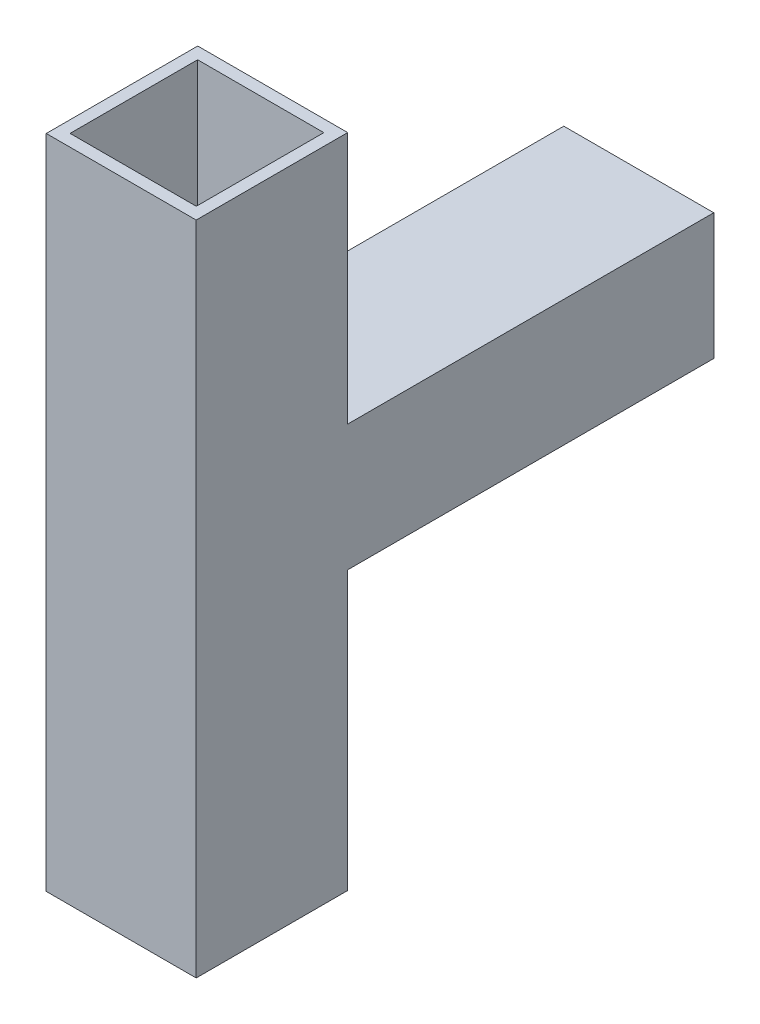
ISO-10303-21;
HEADER;
FILE_DESCRIPTION(('STEP AP214'),'2;1');
FILE_NAME('part.step','',(''),(''),'','','');
FILE_SCHEMA(('AUTOMOTIVE_DESIGN { 1 0 10303 214 1 1 1 1 }'));
ENDSEC;
DATA;
#1=APPLICATION_CONTEXT('core data for automotive mechanical design processes');
#2=APPLICATION_PROTOCOL_DEFINITION('international standard','automotive_design',2000,#1);
#3=PRODUCT_CONTEXT('',#1,'mechanical');
#4=PRODUCT('Part','Part','',(#3));
#5=PRODUCT_RELATED_PRODUCT_CATEGORY('part','',(#4));
#6=PRODUCT_DEFINITION_FORMATION('','',#4);
#7=PRODUCT_DEFINITION_CONTEXT('part definition',#1,'design');
#8=PRODUCT_DEFINITION('design','',#6,#7);
#9=PRODUCT_DEFINITION_SHAPE('','',#8);
#10=(LENGTH_UNIT() NAMED_UNIT(*) SI_UNIT(.MILLI.,.METRE.));
#11=(NAMED_UNIT(*) PLANE_ANGLE_UNIT() SI_UNIT($,.RADIAN.));
#12=(NAMED_UNIT(*) SI_UNIT($,.STERADIAN.) SOLID_ANGLE_UNIT());
#13=UNCERTAINTY_MEASURE_WITH_UNIT(LENGTH_MEASURE(1.E-05),#10,'distance_accuracy_value','');
#14=(GEOMETRIC_REPRESENTATION_CONTEXT(3) GLOBAL_UNCERTAINTY_ASSIGNED_CONTEXT((#13)) GLOBAL_UNIT_ASSIGNED_CONTEXT((#10,
#11,#12)) REPRESENTATION_CONTEXT('',''));
#15=CARTESIAN_POINT('',(0.,0.,0.));
#16=DIRECTION('',(0.,0.,1.));
#17=DIRECTION('',(1.,0.,0.));
#18=AXIS2_PLACEMENT_3D('',#15,#16,#17);
#19=CARTESIAN_POINT('',(-2.96937918952685,26.,-3.));
#20=DIRECTION('',(0.,0.,1.));
#21=DIRECTION('',(1.,0.,0.));
#22=AXIS2_PLACEMENT_3D('',#19,#20,#21);
#23=PLANE('',#22);
#24=DIRECTION('',(1.,0.,0.));
#25=VECTOR('',#24,1.);
#26=CARTESIAN_POINT('',(2.96937918952685,16.,-3.));
#27=LINE('',#26,#25);
#28=CARTESIAN_POINT('',(-2.96937918952685,16.,-3.));
#29=VERTEX_POINT('',#28);
#30=CARTESIAN_POINT('',(2.96937918952685,16.,-3.));
#31=VERTEX_POINT('',#30);
#32=EDGE_CURVE('E203',#29,#31,#27,.T.);
#33=ORIENTED_EDGE('',*,*,#32,.F.);
#34=DIRECTION('',(0.,-1.,0.));
#35=VECTOR('',#34,1.);
#36=CARTESIAN_POINT('',(-2.96937918952685,26.,-3.));
#37=LINE('',#36,#35);
#38=CARTESIAN_POINT('',(-2.96937918952685,26.,-3.));
#39=VERTEX_POINT('',#38);
#40=EDGE_CURVE('E312',#39,#29,#37,.T.);
#41=ORIENTED_EDGE('',*,*,#40,.F.);
#42=DIRECTION('',(-1.,0.,0.));
#43=VECTOR('',#42,1.);
#44=CARTESIAN_POINT('',(-2.96937918952685,26.,-3.));
#45=LINE('',#44,#43);
#46=CARTESIAN_POINT('',(2.96937918952685,26.,-3.));
#47=VERTEX_POINT('',#46);
#48=EDGE_CURVE('E282',#47,#39,#45,.T.);
#49=ORIENTED_EDGE('',*,*,#48,.F.);
#50=DIRECTION('',(0.,-1.,0.));
#51=VECTOR('',#50,1.);
#52=CARTESIAN_POINT('',(2.96937918952685,26.,-3.));
#53=LINE('',#52,#51);
#54=EDGE_CURVE('E11',#47,#31,#53,.T.);
#55=ORIENTED_EDGE('',*,*,#54,.T.);
#56=EDGE_LOOP('',(#33,#41,#49,#55));
#57=FACE_BOUND('',#56,.T.);
#58=ADVANCED_FACE('F38',(#57),#23,.F.);
#59=DIRECTION('',(-1.,0.,0.));
#60=VECTOR('',#59,1.);
#61=CARTESIAN_POINT('',(2.96937918952685,11.,-3.));
#62=LINE('',#61,#60);
#63=CARTESIAN_POINT('',(2.96937918952685,11.,-3.));
#64=VERTEX_POINT('',#63);
#65=CARTESIAN_POINT('',(-2.96937918952685,11.,-3.));
#66=VERTEX_POINT('',#65);
#67=EDGE_CURVE('E197',#64,#66,#62,.T.);
#68=ORIENTED_EDGE('',*,*,#67,.F.);
#69=CARTESIAN_POINT('',(2.96937918952685,0.,-3.));
#70=VERTEX_POINT('',#69);
#71=EDGE_CURVE('E47',#64,#70,#53,.T.);
#72=ORIENTED_EDGE('',*,*,#71,.T.);
#73=DIRECTION('',(-1.,0.,0.));
#74=VECTOR('',#73,1.);
#75=CARTESIAN_POINT('',(-2.96937918952685,0.,-3.));
#76=LINE('',#75,#74);
#77=CARTESIAN_POINT('',(-2.96937918952685,0.,-3.));
#78=VERTEX_POINT('',#77);
#79=EDGE_CURVE('E296',#70,#78,#76,.T.);
#80=ORIENTED_EDGE('',*,*,#79,.T.);
#81=EDGE_CURVE('E311',#66,#78,#37,.T.);
#82=ORIENTED_EDGE('',*,*,#81,.F.);
#83=EDGE_LOOP('',(#68,#72,#80,#82));
#84=FACE_BOUND('',#83,.T.);
#85=ADVANCED_FACE('F328',(#84),#23,.F.);
#86=CARTESIAN_POINT('',(0.,26.,0.));
#87=DIRECTION('',(0.,-1.,0.));
#88=DIRECTION('',(0.,0.,-1.));
#89=AXIS2_PLACEMENT_3D('',#86,#87,#88);
#90=PLANE('',#89);
#91=DIRECTION('',(0.,0.,-1.));
#92=VECTOR('',#91,1.);
#93=CARTESIAN_POINT('',(2.96937918952685,26.,3.));
#94=LINE('',#93,#92);
#95=CARTESIAN_POINT('',(2.96937918952685,26.,3.));
#96=VERTEX_POINT('',#95);
#97=EDGE_CURVE('E278',#96,#47,#94,.T.);
#98=ORIENTED_EDGE('',*,*,#97,.T.);
#99=ORIENTED_EDGE('',*,*,#48,.T.);
#100=DIRECTION('',(0.,0.,1.));
#101=VECTOR('',#100,1.);
#102=CARTESIAN_POINT('',(-2.96937918952685,26.,3.));
#103=LINE('',#102,#101);
#104=CARTESIAN_POINT('',(-2.96937918952685,26.,3.));
#105=VERTEX_POINT('',#104);
#106=EDGE_CURVE('E286',#39,#105,#103,.T.);
#107=ORIENTED_EDGE('',*,*,#106,.T.);
#108=DIRECTION('',(1.,0.,0.));
#109=VECTOR('',#108,1.);
#110=CARTESIAN_POINT('',(-2.96937918952685,26.,3.));
#111=LINE('',#110,#109);
#112=EDGE_CURVE('E289',#105,#96,#111,.T.);
#113=ORIENTED_EDGE('',*,*,#112,.T.);
#114=EDGE_LOOP('',(#98,#99,#107,#113));
#115=FACE_BOUND('',#114,.T.);
#116=DIRECTION('',(0.,0.,-1.));
#117=VECTOR('',#116,1.);
#118=CARTESIAN_POINT('',(2.5,26.,2.5257804818101));
#119=LINE('',#118,#117);
#120=CARTESIAN_POINT('',(2.5,26.,2.5257804818101));
#121=VERTEX_POINT('',#120);
#122=CARTESIAN_POINT('',(2.5,26.,-2.5257804818101));
#123=VERTEX_POINT('',#122);
#124=EDGE_CURVE('E235',#121,#123,#119,.T.);
#125=ORIENTED_EDGE('',*,*,#124,.F.);
#126=DIRECTION('',(1.,0.,0.));
#127=VECTOR('',#126,1.);
#128=CARTESIAN_POINT('',(-2.5,26.,2.5257804818101));
#129=LINE('',#128,#127);
#130=CARTESIAN_POINT('',(-2.5,26.,2.5257804818101));
#131=VERTEX_POINT('',#130);
#132=EDGE_CURVE('E246',#131,#121,#129,.T.);
#133=ORIENTED_EDGE('',*,*,#132,.F.);
#134=DIRECTION('',(0.,0.,1.));
#135=VECTOR('',#134,1.);
#136=CARTESIAN_POINT('',(-2.5,26.,2.5257804818101));
#137=LINE('',#136,#135);
#138=CARTESIAN_POINT('',(-2.5,26.,-2.5257804818101));
#139=VERTEX_POINT('',#138);
#140=EDGE_CURVE('E242',#139,#131,#137,.T.);
#141=ORIENTED_EDGE('',*,*,#140,.F.);
#142=DIRECTION('',(-1.,0.,0.));
#143=VECTOR('',#142,1.);
#144=CARTESIAN_POINT('',(-2.5,26.,-2.5257804818101));
#145=LINE('',#144,#143);
#146=EDGE_CURVE('E238',#123,#139,#145,.T.);
#147=ORIENTED_EDGE('',*,*,#146,.F.);
#148=EDGE_LOOP('',(#125,#133,#141,#147));
#149=FACE_BOUND('',#148,.T.);
#150=ADVANCED_FACE('F343',(#115,#149),#90,.F.);
#151=CARTESIAN_POINT('',(0.,0.,0.));
#152=DIRECTION('',(0.,-1.,0.));
#153=DIRECTION('',(0.,0.,-1.));
#154=AXIS2_PLACEMENT_3D('',#151,#152,#153);
#155=PLANE('',#154);
#156=DIRECTION('',(0.,0.,-1.));
#157=VECTOR('',#156,1.);
#158=CARTESIAN_POINT('',(2.96937918952685,0.,3.));
#159=LINE('',#158,#157);
#160=CARTESIAN_POINT('',(2.96937918952685,0.,3.));
#161=VERTEX_POINT('',#160);
#162=EDGE_CURVE('E277',#161,#70,#159,.T.);
#163=ORIENTED_EDGE('',*,*,#162,.F.);
#164=DIRECTION('',(1.,0.,0.));
#165=VECTOR('',#164,1.);
#166=CARTESIAN_POINT('',(-2.96937918952685,0.,3.));
#167=LINE('',#166,#165);
#168=CARTESIAN_POINT('',(-2.96937918952685,0.,3.));
#169=VERTEX_POINT('',#168);
#170=EDGE_CURVE('E283',#169,#161,#167,.T.);
#171=ORIENTED_EDGE('',*,*,#170,.F.);
#172=DIRECTION('',(0.,0.,1.));
#173=VECTOR('',#172,1.);
#174=CARTESIAN_POINT('',(-2.96937918952685,0.,3.));
#175=LINE('',#174,#173);
#176=EDGE_CURVE('E300',#78,#169,#175,.T.);
#177=ORIENTED_EDGE('',*,*,#176,.F.);
#178=ORIENTED_EDGE('',*,*,#79,.F.);
#179=EDGE_LOOP('',(#163,#171,#177,#178));
#180=FACE_BOUND('',#179,.T.);
#181=DIRECTION('',(1.,0.,0.));
#182=VECTOR('',#181,1.);
#183=CARTESIAN_POINT('',(-2.5,0.,2.5257804818101));
#184=LINE('',#183,#182);
#185=CARTESIAN_POINT('',(-2.5,0.,2.5257804818101));
#186=VERTEX_POINT('',#185);
#187=CARTESIAN_POINT('',(2.5,0.,2.5257804818101));
#188=VERTEX_POINT('',#187);
#189=EDGE_CURVE('E239',#186,#188,#184,.T.);
#190=ORIENTED_EDGE('',*,*,#189,.T.);
#191=DIRECTION('',(0.,0.,-1.));
#192=VECTOR('',#191,1.);
#193=CARTESIAN_POINT('',(2.5,0.,2.5257804818101));
#194=LINE('',#193,#192);
#195=CARTESIAN_POINT('',(2.5,0.,-2.5257804818101));
#196=VERTEX_POINT('',#195);
#197=EDGE_CURVE('E234',#188,#196,#194,.T.);
#198=ORIENTED_EDGE('',*,*,#197,.T.);
#199=DIRECTION('',(-1.,0.,0.));
#200=VECTOR('',#199,1.);
#201=CARTESIAN_POINT('',(-2.5,0.,-2.5257804818101));
#202=LINE('',#201,#200);
#203=CARTESIAN_POINT('',(-2.5,0.,-2.5257804818101));
#204=VERTEX_POINT('',#203);
#205=EDGE_CURVE('E253',#196,#204,#202,.T.);
#206=ORIENTED_EDGE('',*,*,#205,.T.);
#207=DIRECTION('',(0.,0.,1.));
#208=VECTOR('',#207,1.);
#209=CARTESIAN_POINT('',(-2.5,0.,2.5257804818101));
#210=LINE('',#209,#208);
#211=EDGE_CURVE('E257',#204,#186,#210,.T.);
#212=ORIENTED_EDGE('',*,*,#211,.T.);
#213=EDGE_LOOP('',(#190,#198,#206,#212));
#214=FACE_BOUND('',#213,.T.);
#215=ADVANCED_FACE('F333',(#180,#214),#155,.T.);
#216=CARTESIAN_POINT('',(2.96937918952685,26.,3.));
#217=DIRECTION('',(-1.,0.,0.));
#218=DIRECTION('',(0.,0.,1.));
#219=AXIS2_PLACEMENT_3D('',#216,#217,#218);
#220=PLANE('',#219);
#221=ORIENTED_EDGE('',*,*,#162,.T.);
#222=ORIENTED_EDGE('',*,*,#71,.F.);
#223=DIRECTION('',(0.,0.,1.));
#224=VECTOR('',#223,1.);
#225=CARTESIAN_POINT('',(2.96937918952685,11.,-17.5));
#226=LINE('',#225,#224);
#227=CARTESIAN_POINT('',(2.96937918952685,11.,-17.5));
#228=VERTEX_POINT('',#227);
#229=EDGE_CURVE('E230',#228,#64,#226,.T.);
#230=ORIENTED_EDGE('',*,*,#229,.F.);
#231=DIRECTION('',(0.,-1.,0.));
#232=VECTOR('',#231,1.);
#233=CARTESIAN_POINT('',(2.96937918952685,11.,-17.5));
#234=LINE('',#233,#232);
#235=CARTESIAN_POINT('',(2.96937918952685,16.,-17.5));
#236=VERTEX_POINT('',#235);
#237=EDGE_CURVE('E198',#236,#228,#234,.T.);
#238=ORIENTED_EDGE('',*,*,#237,.F.);
#239=DIRECTION('',(0.,0.,1.));
#240=VECTOR('',#239,1.);
#241=CARTESIAN_POINT('',(2.96937918952685,16.,-17.5));
#242=LINE('',#241,#240);
#243=EDGE_CURVE('E212',#236,#31,#242,.T.);
#244=ORIENTED_EDGE('',*,*,#243,.T.);
#245=ORIENTED_EDGE('',*,*,#54,.F.);
#246=ORIENTED_EDGE('',*,*,#97,.F.);
#247=DIRECTION('',(0.,-1.,0.));
#248=VECTOR('',#247,1.);
#249=CARTESIAN_POINT('',(2.96937918952685,26.,3.));
#250=LINE('',#249,#248);
#251=EDGE_CURVE('E292',#96,#161,#250,.T.);
#252=ORIENTED_EDGE('',*,*,#251,.T.);
#253=EDGE_LOOP('',(#221,#222,#230,#238,#244,#245,#246,#252));
#254=FACE_BOUND('',#253,.T.);
#255=ADVANCED_FACE('F40',(#254),#220,.F.);
#256=CARTESIAN_POINT('',(-2.96937918952685,26.,3.));
#257=DIRECTION('',(1.,0.,0.));
#258=DIRECTION('',(0.,0.,-1.));
#259=AXIS2_PLACEMENT_3D('',#256,#257,#258);
#260=PLANE('',#259);
#261=ORIENTED_EDGE('',*,*,#176,.T.);
#262=DIRECTION('',(0.,-1.,0.));
#263=VECTOR('',#262,1.);
#264=CARTESIAN_POINT('',(-2.96937918952685,26.,3.));
#265=LINE('',#264,#263);
#266=EDGE_CURVE('E308',#105,#169,#265,.T.);
#267=ORIENTED_EDGE('',*,*,#266,.F.);
#268=ORIENTED_EDGE('',*,*,#106,.F.);
#269=ORIENTED_EDGE('',*,*,#40,.T.);
#270=DIRECTION('',(0.,0.,1.));
#271=VECTOR('',#270,1.);
#272=CARTESIAN_POINT('',(-2.96937918952685,16.,-17.5));
#273=LINE('',#272,#271);
#274=CARTESIAN_POINT('',(-2.96937918952685,16.,-17.5));
#275=VERTEX_POINT('',#274);
#276=EDGE_CURVE('E222',#275,#29,#273,.T.);
#277=ORIENTED_EDGE('',*,*,#276,.F.);
#278=DIRECTION('',(0.,1.,0.));
#279=VECTOR('',#278,1.);
#280=CARTESIAN_POINT('',(-2.96937918952685,11.,-17.5));
#281=LINE('',#280,#279);
#282=CARTESIAN_POINT('',(-2.96937918952685,11.,-17.5));
#283=VERTEX_POINT('',#282);
#284=EDGE_CURVE('E206',#283,#275,#281,.T.);
#285=ORIENTED_EDGE('',*,*,#284,.F.);
#286=DIRECTION('',(0.,0.,1.));
#287=VECTOR('',#286,1.);
#288=CARTESIAN_POINT('',(-2.96937918952685,11.,-17.5));
#289=LINE('',#288,#287);
#290=EDGE_CURVE('E226',#283,#66,#289,.T.);
#291=ORIENTED_EDGE('',*,*,#290,.T.);
#292=ORIENTED_EDGE('',*,*,#81,.T.);
#293=EDGE_LOOP('',(#261,#267,#268,#269,#277,#285,#291,#292));
#294=FACE_BOUND('',#293,.T.);
#295=ADVANCED_FACE('F321',(#294),#260,.F.);
#296=CARTESIAN_POINT('',(-2.96937918952685,26.,3.));
#297=DIRECTION('',(0.,0.,-1.));
#298=DIRECTION('',(-1.,0.,0.));
#299=AXIS2_PLACEMENT_3D('',#296,#297,#298);
#300=PLANE('',#299);
#301=ORIENTED_EDGE('',*,*,#170,.T.);
#302=ORIENTED_EDGE('',*,*,#251,.F.);
#303=ORIENTED_EDGE('',*,*,#112,.F.);
#304=ORIENTED_EDGE('',*,*,#266,.T.);
#305=EDGE_LOOP('',(#301,#302,#303,#304));
#306=FACE_BOUND('',#305,.T.);
#307=ADVANCED_FACE('F337',(#306),#300,.F.);
#308=CARTESIAN_POINT('',(2.5,26.,2.5257804818101));
#309=DIRECTION('',(-1.,0.,0.));
#310=DIRECTION('',(0.,0.,1.));
#311=AXIS2_PLACEMENT_3D('',#308,#309,#310);
#312=PLANE('',#311);
#313=ORIENTED_EDGE('',*,*,#197,.F.);
#314=DIRECTION('',(0.,-1.,0.));
#315=VECTOR('',#314,1.);
#316=CARTESIAN_POINT('',(2.5,26.,2.5257804818101));
#317=LINE('',#316,#315);
#318=EDGE_CURVE('E249',#121,#188,#317,.T.);
#319=ORIENTED_EDGE('',*,*,#318,.F.);
#320=ORIENTED_EDGE('',*,*,#124,.T.);
#321=DIRECTION('',(0.,-1.,0.));
#322=VECTOR('',#321,1.);
#323=CARTESIAN_POINT('',(2.5,26.,-2.5257804818101));
#324=LINE('',#323,#322);
#325=EDGE_CURVE('E273',#123,#196,#324,.T.);
#326=ORIENTED_EDGE('',*,*,#325,.T.);
#327=EDGE_LOOP('',(#313,#319,#320,#326));
#328=FACE_BOUND('',#327,.T.);
#329=ADVANCED_FACE('F377',(#328),#312,.T.);
#330=CARTESIAN_POINT('',(-2.5,26.,-2.5257804818101));
#331=DIRECTION('',(0.,0.,1.));
#332=DIRECTION('',(1.,0.,0.));
#333=AXIS2_PLACEMENT_3D('',#330,#331,#332);
#334=PLANE('',#333);
#335=DIRECTION('',(1.,0.,0.));
#336=VECTOR('',#335,1.);
#337=CARTESIAN_POINT('',(1.96937918952685,15.5,-2.5257804818101));
#338=LINE('',#337,#336);
#339=CARTESIAN_POINT('',(-2.03062081047315,15.5,-2.5257804818101));
#340=VERTEX_POINT('',#339);
#341=CARTESIAN_POINT('',(1.96937918952685,15.5,-2.5257804818101));
#342=VERTEX_POINT('',#341);
#343=EDGE_CURVE('E166',#340,#342,#338,.T.);
#344=ORIENTED_EDGE('',*,*,#343,.T.);
#345=DIRECTION('',(0.,-1.,0.));
#346=VECTOR('',#345,1.);
#347=CARTESIAN_POINT('',(1.96937918952685,11.5,-2.5257804818101));
#348=LINE('',#347,#346);
#349=CARTESIAN_POINT('',(1.96937918952685,11.5,-2.5257804818101));
#350=VERTEX_POINT('',#349);
#351=EDGE_CURVE('E152',#342,#350,#348,.T.);
#352=ORIENTED_EDGE('',*,*,#351,.T.);
#353=DIRECTION('',(-1.,0.,0.));
#354=VECTOR('',#353,1.);
#355=CARTESIAN_POINT('',(1.96937918952685,11.5,-2.5257804818101));
#356=LINE('',#355,#354);
#357=CARTESIAN_POINT('',(-2.03062081047315,11.5,-2.5257804818101));
#358=VERTEX_POINT('',#357);
#359=EDGE_CURVE('E188',#350,#358,#356,.T.);
#360=ORIENTED_EDGE('',*,*,#359,.T.);
#361=DIRECTION('',(0.,1.,0.));
#362=VECTOR('',#361,1.);
#363=CARTESIAN_POINT('',(-2.03062081047315,11.5,-2.5257804818101));
#364=LINE('',#363,#362);
#365=EDGE_CURVE('E175',#358,#340,#364,.T.);
#366=ORIENTED_EDGE('',*,*,#365,.T.);
#367=EDGE_LOOP('',(#344,#352,#360,#366));
#368=FACE_BOUND('',#367,.T.);
#369=ORIENTED_EDGE('',*,*,#205,.F.);
#370=ORIENTED_EDGE('',*,*,#325,.F.);
#371=ORIENTED_EDGE('',*,*,#146,.T.);
#372=DIRECTION('',(0.,-1.,0.));
#373=VECTOR('',#372,1.);
#374=CARTESIAN_POINT('',(-2.5,26.,-2.5257804818101));
#375=LINE('',#374,#373);
#376=EDGE_CURVE('E270',#139,#204,#375,.T.);
#377=ORIENTED_EDGE('',*,*,#376,.T.);
#378=EDGE_LOOP('',(#369,#370,#371,#377));
#379=FACE_BOUND('',#378,.T.);
#380=ADVANCED_FACE('F173',(#368,#379),#334,.T.);
#381=CARTESIAN_POINT('',(-2.5,26.,2.5257804818101));
#382=DIRECTION('',(1.,0.,0.));
#383=DIRECTION('',(0.,0.,-1.));
#384=AXIS2_PLACEMENT_3D('',#381,#382,#383);
#385=PLANE('',#384);
#386=ORIENTED_EDGE('',*,*,#211,.F.);
#387=ORIENTED_EDGE('',*,*,#376,.F.);
#388=ORIENTED_EDGE('',*,*,#140,.T.);
#389=DIRECTION('',(0.,-1.,0.));
#390=VECTOR('',#389,1.);
#391=CARTESIAN_POINT('',(-2.5,26.,2.5257804818101));
#392=LINE('',#391,#390);
#393=EDGE_CURVE('E267',#131,#186,#392,.T.);
#394=ORIENTED_EDGE('',*,*,#393,.T.);
#395=EDGE_LOOP('',(#386,#387,#388,#394));
#396=FACE_BOUND('',#395,.T.);
#397=ADVANCED_FACE('F365',(#396),#385,.T.);
#398=CARTESIAN_POINT('',(-2.5,26.,2.5257804818101));
#399=DIRECTION('',(0.,0.,-1.));
#400=DIRECTION('',(-1.,0.,0.));
#401=AXIS2_PLACEMENT_3D('',#398,#399,#400);
#402=PLANE('',#401);
#403=ORIENTED_EDGE('',*,*,#189,.F.);
#404=ORIENTED_EDGE('',*,*,#393,.F.);
#405=ORIENTED_EDGE('',*,*,#132,.T.);
#406=ORIENTED_EDGE('',*,*,#318,.T.);
#407=EDGE_LOOP('',(#403,#404,#405,#406));
#408=FACE_BOUND('',#407,.T.);
#409=ADVANCED_FACE('F357',(#408),#402,.T.);
#410=CARTESIAN_POINT('',(2.96937918952685,11.,-17.5));
#411=DIRECTION('',(0.,1.,0.));
#412=DIRECTION('',(0.,0.,1.));
#413=AXIS2_PLACEMENT_3D('',#410,#411,#412);
#414=PLANE('',#413);
#415=ORIENTED_EDGE('',*,*,#67,.T.);
#416=ORIENTED_EDGE('',*,*,#290,.F.);
#417=DIRECTION('',(-1.,0.,0.));
#418=VECTOR('',#417,1.);
#419=CARTESIAN_POINT('',(2.96937918952685,11.,-17.5));
#420=LINE('',#419,#418);
#421=EDGE_CURVE('E202',#228,#283,#420,.T.);
#422=ORIENTED_EDGE('',*,*,#421,.F.);
#423=ORIENTED_EDGE('',*,*,#229,.T.);
#424=EDGE_LOOP('',(#415,#416,#422,#423));
#425=FACE_BOUND('',#424,.T.);
#426=ADVANCED_FACE('F355',(#425),#414,.F.);
#427=CARTESIAN_POINT('',(2.96937918952685,16.,-17.5));
#428=DIRECTION('',(0.,-1.,0.));
#429=DIRECTION('',(0.,0.,-1.));
#430=AXIS2_PLACEMENT_3D('',#427,#428,#429);
#431=PLANE('',#430);
#432=ORIENTED_EDGE('',*,*,#32,.T.);
#433=ORIENTED_EDGE('',*,*,#243,.F.);
#434=DIRECTION('',(1.,0.,0.));
#435=VECTOR('',#434,1.);
#436=CARTESIAN_POINT('',(2.96937918952685,16.,-17.5));
#437=LINE('',#436,#435);
#438=EDGE_CURVE('E209',#275,#236,#437,.T.);
#439=ORIENTED_EDGE('',*,*,#438,.F.);
#440=ORIENTED_EDGE('',*,*,#276,.T.);
#441=EDGE_LOOP('',(#432,#433,#439,#440));
#442=FACE_BOUND('',#441,.T.);
#443=ADVANCED_FACE('F348',(#442),#431,.F.);
#444=CARTESIAN_POINT('',(0.,0.,-17.5));
#445=DIRECTION('',(0.,0.,1.));
#446=DIRECTION('',(1.,0.,0.));
#447=AXIS2_PLACEMENT_3D('',#444,#445,#446);
#448=PLANE('',#447);
#449=DIRECTION('',(0.,-1.,0.));
#450=VECTOR('',#449,1.);
#451=CARTESIAN_POINT('',(1.96937918952685,11.5,-17.5));
#452=LINE('',#451,#450);
#453=CARTESIAN_POINT('',(1.96937918952685,15.5,-17.5));
#454=VERTEX_POINT('',#453);
#455=CARTESIAN_POINT('',(1.96937918952685,11.5,-17.5));
#456=VERTEX_POINT('',#455);
#457=EDGE_CURVE('E179',#454,#456,#452,.T.);
#458=ORIENTED_EDGE('',*,*,#457,.F.);
#459=DIRECTION('',(1.,0.,0.));
#460=VECTOR('',#459,1.);
#461=CARTESIAN_POINT('',(1.96937918952685,15.5,-17.5));
#462=LINE('',#461,#460);
#463=CARTESIAN_POINT('',(-2.03062081047315,15.5,-17.5));
#464=VERTEX_POINT('',#463);
#465=EDGE_CURVE('E169',#464,#454,#462,.T.);
#466=ORIENTED_EDGE('',*,*,#465,.F.);
#467=DIRECTION('',(0.,1.,0.));
#468=VECTOR('',#467,1.);
#469=CARTESIAN_POINT('',(-2.03062081047315,11.5,-17.5));
#470=LINE('',#469,#468);
#471=CARTESIAN_POINT('',(-2.03062081047315,11.5,-17.5));
#472=VERTEX_POINT('',#471);
#473=EDGE_CURVE('E183',#472,#464,#470,.T.);
#474=ORIENTED_EDGE('',*,*,#473,.F.);
#475=DIRECTION('',(-1.,0.,0.));
#476=VECTOR('',#475,1.);
#477=CARTESIAN_POINT('',(1.96937918952685,11.5,-17.5));
#478=LINE('',#477,#476);
#479=EDGE_CURVE('E62',#456,#472,#478,.T.);
#480=ORIENTED_EDGE('',*,*,#479,.F.);
#481=EDGE_LOOP('',(#458,#466,#474,#480));
#482=FACE_BOUND('',#481,.T.);
#483=ORIENTED_EDGE('',*,*,#237,.T.);
#484=ORIENTED_EDGE('',*,*,#421,.T.);
#485=ORIENTED_EDGE('',*,*,#284,.T.);
#486=ORIENTED_EDGE('',*,*,#438,.T.);
#487=EDGE_LOOP('',(#483,#484,#485,#486));
#488=FACE_BOUND('',#487,.T.);
#489=ADVANCED_FACE('F353',(#482,#488),#448,.F.);
#490=CARTESIAN_POINT('',(1.96937918952685,15.5,3.13107376768228));
#491=DIRECTION('',(0.,1.,0.));
#492=DIRECTION('',(0.,0.,1.));
#493=AXIS2_PLACEMENT_3D('',#490,#491,#492);
#494=PLANE('',#493);
#495=DIRECTION('',(0.,0.,-1.));
#496=VECTOR('',#495,1.);
#497=CARTESIAN_POINT('',(-2.03062081047315,15.5,3.13107376768228));
#498=LINE('',#497,#496);
#499=EDGE_CURVE('E54',#340,#464,#498,.T.);
#500=ORIENTED_EDGE('',*,*,#499,.T.);
#501=ORIENTED_EDGE('',*,*,#465,.T.);
#502=DIRECTION('',(0.,0.,-1.));
#503=VECTOR('',#502,1.);
#504=CARTESIAN_POINT('',(1.96937918952685,15.5,3.13107376768228));
#505=LINE('',#504,#503);
#506=EDGE_CURVE('E156',#342,#454,#505,.T.);
#507=ORIENTED_EDGE('',*,*,#506,.F.);
#508=ORIENTED_EDGE('',*,*,#343,.F.);
#509=EDGE_LOOP('',(#500,#501,#507,#508));
#510=FACE_BOUND('',#509,.T.);
#511=ADVANCED_FACE('F165',(#510),#494,.F.);
#512=CARTESIAN_POINT('',(1.96937918952685,11.5,3.13107376768228));
#513=DIRECTION('',(1.,0.,0.));
#514=DIRECTION('',(0.,0.,-1.));
#515=AXIS2_PLACEMENT_3D('',#512,#513,#514);
#516=PLANE('',#515);
#517=ORIENTED_EDGE('',*,*,#506,.T.);
#518=ORIENTED_EDGE('',*,*,#457,.T.);
#519=DIRECTION('',(0.,0.,-1.));
#520=VECTOR('',#519,1.);
#521=CARTESIAN_POINT('',(1.96937918952685,11.5,3.13107376768228));
#522=LINE('',#521,#520);
#523=EDGE_CURVE('E158',#350,#456,#522,.T.);
#524=ORIENTED_EDGE('',*,*,#523,.F.);
#525=ORIENTED_EDGE('',*,*,#351,.F.);
#526=EDGE_LOOP('',(#517,#518,#524,#525));
#527=FACE_BOUND('',#526,.T.);
#528=ADVANCED_FACE('F154',(#527),#516,.F.);
#529=CARTESIAN_POINT('',(1.96937918952685,11.5,3.13107376768228));
#530=DIRECTION('',(0.,-1.,0.));
#531=DIRECTION('',(0.,0.,-1.));
#532=AXIS2_PLACEMENT_3D('',#529,#530,#531);
#533=PLANE('',#532);
#534=ORIENTED_EDGE('',*,*,#523,.T.);
#535=ORIENTED_EDGE('',*,*,#479,.T.);
#536=DIRECTION('',(0.,0.,-1.));
#537=VECTOR('',#536,1.);
#538=CARTESIAN_POINT('',(-2.03062081047315,11.5,3.13107376768228));
#539=LINE('',#538,#537);
#540=EDGE_CURVE('E187',#358,#472,#539,.T.);
#541=ORIENTED_EDGE('',*,*,#540,.F.);
#542=ORIENTED_EDGE('',*,*,#359,.F.);
#543=EDGE_LOOP('',(#534,#535,#541,#542));
#544=FACE_BOUND('',#543,.T.);
#545=ADVANCED_FACE('F461',(#544),#533,.F.);
#546=CARTESIAN_POINT('',(-2.03062081047315,11.5,3.13107376768228));
#547=DIRECTION('',(-1.,0.,0.));
#548=DIRECTION('',(0.,0.,1.));
#549=AXIS2_PLACEMENT_3D('',#546,#547,#548);
#550=PLANE('',#549);
#551=ORIENTED_EDGE('',*,*,#540,.T.);
#552=ORIENTED_EDGE('',*,*,#473,.T.);
#553=ORIENTED_EDGE('',*,*,#499,.F.);
#554=ORIENTED_EDGE('',*,*,#365,.F.);
#555=EDGE_LOOP('',(#551,#552,#553,#554));
#556=FACE_BOUND('',#555,.T.);
#557=ADVANCED_FACE('F470',(#556),#550,.F.);
#558=CLOSED_SHELL('',(#58,#85,#150,#215,#255,#295,#307,#329,#380,#397,#409,#426,#443,#489,#511,
#528,#545,#557));
#559=MANIFOLD_SOLID_BREP('B2',#558);
#560=ADVANCED_BREP_SHAPE_REPRESENTATION('',(#18,#559),#14);
#561=SHAPE_DEFINITION_REPRESENTATION(#9,#560);
ENDSEC;
END-ISO-10303-21;
